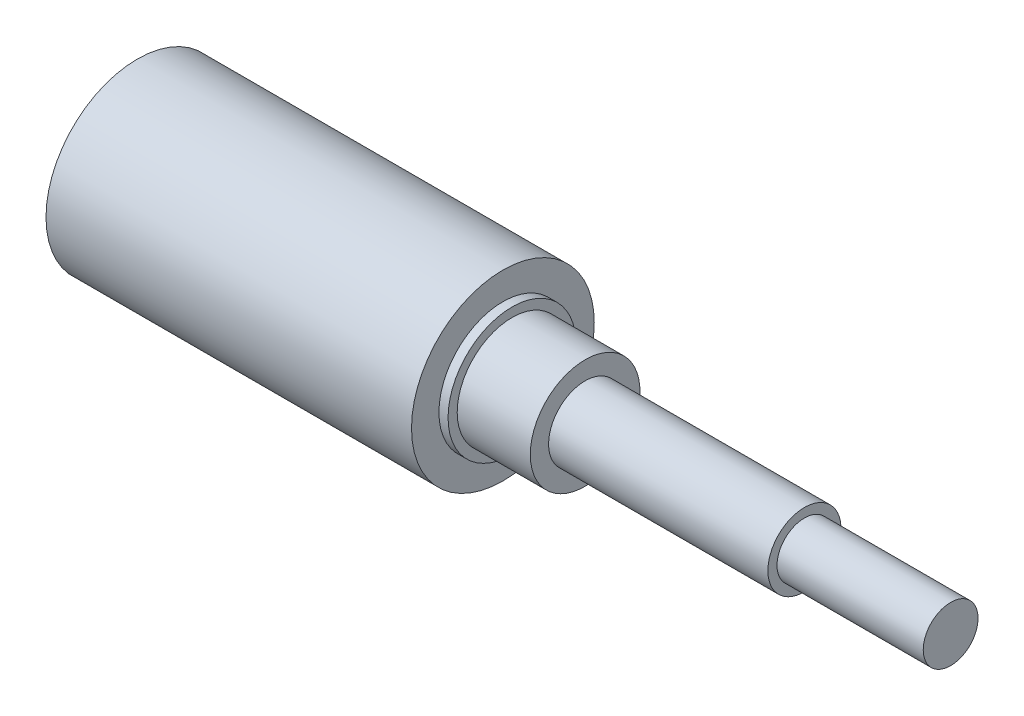
ISO-10303-21;
HEADER;
FILE_DESCRIPTION(('STEP AP214'),'2;1');
FILE_NAME('part.step','',(''),(''),'','','');
FILE_SCHEMA(('AUTOMOTIVE_DESIGN { 1 0 10303 214 1 1 1 1 }'));
ENDSEC;
DATA;
#1=APPLICATION_CONTEXT('core data for automotive mechanical design processes');
#2=APPLICATION_PROTOCOL_DEFINITION('international standard','automotive_design',2000,#1);
#3=PRODUCT_CONTEXT('',#1,'mechanical');
#4=PRODUCT('Part','Part','',(#3));
#5=PRODUCT_RELATED_PRODUCT_CATEGORY('part','',(#4));
#6=PRODUCT_DEFINITION_FORMATION('','',#4);
#7=PRODUCT_DEFINITION_CONTEXT('part definition',#1,'design');
#8=PRODUCT_DEFINITION('design','',#6,#7);
#9=PRODUCT_DEFINITION_SHAPE('','',#8);
#10=(LENGTH_UNIT() NAMED_UNIT(*) SI_UNIT(.MILLI.,.METRE.));
#11=(NAMED_UNIT(*) PLANE_ANGLE_UNIT() SI_UNIT($,.RADIAN.));
#12=(NAMED_UNIT(*) SI_UNIT($,.STERADIAN.) SOLID_ANGLE_UNIT());
#13=UNCERTAINTY_MEASURE_WITH_UNIT(LENGTH_MEASURE(1.E-05),#10,'distance_accuracy_value','');
#14=(GEOMETRIC_REPRESENTATION_CONTEXT(3) GLOBAL_UNCERTAINTY_ASSIGNED_CONTEXT((#13)) GLOBAL_UNIT_ASSIGNED_CONTEXT((#10,
#11,#12)) REPRESENTATION_CONTEXT('',''));
#15=CARTESIAN_POINT('',(0.,0.,0.));
#16=DIRECTION('',(0.,0.,1.));
#17=DIRECTION('',(1.,0.,0.));
#18=AXIS2_PLACEMENT_3D('',#15,#16,#17);
#19=CARTESIAN_POINT('',(0.,4.99999999999999,0.));
#20=DIRECTION('',(1.,0.,0.));
#21=DIRECTION('',(0.,0.,-1.));
#22=AXIS2_PLACEMENT_3D('',#19,#20,#21);
#23=PLANE('',#22);
#24=CARTESIAN_POINT('',(0.,0.,0.));
#25=DIRECTION('',(-1.,0.,0.));
#26=DIRECTION('',(0.,0.,1.));
#27=AXIS2_PLACEMENT_3D('',#24,#25,#26);
#28=CIRCLE('',#27,4.99999999999999);
#29=CARTESIAN_POINT('',(0.,0.,4.99999999999999));
#30=VERTEX_POINT('',#29);
#31=EDGE_CURVE('E65',#30,#30,#28,.T.);
#32=ORIENTED_EDGE('',*,*,#31,.T.);
#33=EDGE_LOOP('',(#32));
#34=FACE_BOUND('',#33,.T.);
#35=ADVANCED_FACE('F31',(#34),#23,.F.);
#36=CARTESIAN_POINT('',(44.5,0.,0.));
#37=DIRECTION('',(-1.,0.,0.));
#38=DIRECTION('',(0.,0.,1.));
#39=AXIS2_PLACEMENT_3D('',#36,#37,#38);
#40=PLANE('',#39);
#41=CARTESIAN_POINT('',(44.5,0.,0.));
#42=DIRECTION('',(-1.,0.,0.));
#43=DIRECTION('',(0.,0.,1.));
#44=AXIS2_PLACEMENT_3D('',#41,#42,#43);
#45=CIRCLE('',#44,1.5);
#46=CARTESIAN_POINT('',(44.5,0.,1.5));
#47=VERTEX_POINT('',#46);
#48=EDGE_CURVE('E10',#47,#47,#45,.T.);
#49=ORIENTED_EDGE('',*,*,#48,.F.);
#50=EDGE_LOOP('',(#49));
#51=FACE_BOUND('',#50,.T.);
#52=ADVANCED_FACE('F119',(#51),#40,.F.);
#53=CARTESIAN_POINT('',(0.,0.,0.));
#54=DIRECTION('',(-1.,0.,0.));
#55=DIRECTION('',(0.,0.,1.));
#56=AXIS2_PLACEMENT_3D('',#53,#54,#55);
#57=CYLINDRICAL_SURFACE('',#56,1.5);
#58=CARTESIAN_POINT('',(36.5,0.,0.));
#59=DIRECTION('',(-1.,0.,0.));
#60=DIRECTION('',(0.,0.,1.));
#61=AXIS2_PLACEMENT_3D('',#58,#59,#60);
#62=CIRCLE('',#61,1.5);
#63=CARTESIAN_POINT('',(36.5,0.,1.5));
#64=VERTEX_POINT('',#63);
#65=EDGE_CURVE('E37',#64,#64,#62,.T.);
#66=ORIENTED_EDGE('',*,*,#65,.F.);
#67=EDGE_LOOP('',(#66));
#68=FACE_BOUND('',#67,.T.);
#69=ORIENTED_EDGE('',*,*,#48,.T.);
#70=EDGE_LOOP('',(#69));
#71=FACE_BOUND('',#70,.T.);
#72=ADVANCED_FACE('F114',(#68,#71),#57,.T.);
#73=CARTESIAN_POINT('',(36.5,2.,0.));
#74=DIRECTION('',(-1.,0.,0.));
#75=DIRECTION('',(0.,0.,1.));
#76=AXIS2_PLACEMENT_3D('',#73,#74,#75);
#77=PLANE('',#76);
#78=CARTESIAN_POINT('',(36.5,0.,0.));
#79=DIRECTION('',(-1.,0.,0.));
#80=DIRECTION('',(0.,0.,1.));
#81=AXIS2_PLACEMENT_3D('',#78,#79,#80);
#82=CIRCLE('',#81,2.);
#83=CARTESIAN_POINT('',(36.5,0.,2.));
#84=VERTEX_POINT('',#83);
#85=EDGE_CURVE('E41',#84,#84,#82,.T.);
#86=ORIENTED_EDGE('',*,*,#85,.F.);
#87=EDGE_LOOP('',(#86));
#88=FACE_BOUND('',#87,.T.);
#89=ORIENTED_EDGE('',*,*,#65,.T.);
#90=EDGE_LOOP('',(#89));
#91=FACE_BOUND('',#90,.T.);
#92=ADVANCED_FACE('F109',(#88,#91),#77,.F.);
#93=CARTESIAN_POINT('',(0.,0.,0.));
#94=DIRECTION('',(-1.,0.,0.));
#95=DIRECTION('',(0.,0.,1.));
#96=AXIS2_PLACEMENT_3D('',#93,#94,#95);
#97=CYLINDRICAL_SURFACE('',#96,2.);
#98=CARTESIAN_POINT('',(24.5,0.,0.));
#99=DIRECTION('',(-1.,0.,0.));
#100=DIRECTION('',(0.,0.,1.));
#101=AXIS2_PLACEMENT_3D('',#98,#99,#100);
#102=CIRCLE('',#101,2.);
#103=CARTESIAN_POINT('',(24.5,0.,2.));
#104=VERTEX_POINT('',#103);
#105=EDGE_CURVE('E45',#104,#104,#102,.T.);
#106=ORIENTED_EDGE('',*,*,#105,.F.);
#107=EDGE_LOOP('',(#106));
#108=FACE_BOUND('',#107,.T.);
#109=ORIENTED_EDGE('',*,*,#85,.T.);
#110=EDGE_LOOP('',(#109));
#111=FACE_BOUND('',#110,.T.);
#112=ADVANCED_FACE('F103',(#108,#111),#97,.T.);
#113=CARTESIAN_POINT('',(24.5,2.,0.));
#114=DIRECTION('',(-1.,0.,0.));
#115=DIRECTION('',(0.,0.,1.));
#116=AXIS2_PLACEMENT_3D('',#113,#114,#115);
#117=PLANE('',#116);
#118=CARTESIAN_POINT('',(24.5,0.,0.));
#119=DIRECTION('',(-1.,0.,0.));
#120=DIRECTION('',(0.,0.,1.));
#121=AXIS2_PLACEMENT_3D('',#118,#119,#120);
#122=CIRCLE('',#121,3.);
#123=CARTESIAN_POINT('',(24.5,0.,3.));
#124=VERTEX_POINT('',#123);
#125=EDGE_CURVE('E50',#124,#124,#122,.T.);
#126=ORIENTED_EDGE('',*,*,#125,.F.);
#127=EDGE_LOOP('',(#126));
#128=FACE_BOUND('',#127,.T.);
#129=ORIENTED_EDGE('',*,*,#105,.T.);
#130=EDGE_LOOP('',(#129));
#131=FACE_BOUND('',#130,.T.);
#132=ADVANCED_FACE('F97',(#128,#131),#117,.F.);
#133=CARTESIAN_POINT('',(0.,0.,0.));
#134=DIRECTION('',(-1.,0.,0.));
#135=DIRECTION('',(0.,0.,1.));
#136=AXIS2_PLACEMENT_3D('',#133,#134,#135);
#137=CYLINDRICAL_SURFACE('',#136,3.);
#138=CARTESIAN_POINT('',(20.5,0.,0.));
#139=DIRECTION('',(-1.,0.,0.));
#140=DIRECTION('',(0.,0.,1.));
#141=AXIS2_PLACEMENT_3D('',#138,#139,#140);
#142=CIRCLE('',#141,3.);
#143=CARTESIAN_POINT('',(20.5,0.,3.));
#144=VERTEX_POINT('',#143);
#145=EDGE_CURVE('E53',#144,#144,#142,.T.);
#146=ORIENTED_EDGE('',*,*,#145,.F.);
#147=EDGE_LOOP('',(#146));
#148=FACE_BOUND('',#147,.T.);
#149=ORIENTED_EDGE('',*,*,#125,.T.);
#150=EDGE_LOOP('',(#149));
#151=FACE_BOUND('',#150,.T.);
#152=ADVANCED_FACE('F91',(#148,#151),#137,.T.);
#153=CARTESIAN_POINT('',(20.5,3.5,0.));
#154=DIRECTION('',(-1.,0.,0.));
#155=DIRECTION('',(0.,0.,1.));
#156=AXIS2_PLACEMENT_3D('',#153,#154,#155);
#157=PLANE('',#156);
#158=CARTESIAN_POINT('',(20.5,0.,0.));
#159=DIRECTION('',(-1.,0.,0.));
#160=DIRECTION('',(0.,0.,1.));
#161=AXIS2_PLACEMENT_3D('',#158,#159,#160);
#162=CIRCLE('',#161,3.5);
#163=CARTESIAN_POINT('',(20.5,0.,3.5));
#164=VERTEX_POINT('',#163);
#165=EDGE_CURVE('E56',#164,#164,#162,.T.);
#166=ORIENTED_EDGE('',*,*,#165,.F.);
#167=EDGE_LOOP('',(#166));
#168=FACE_BOUND('',#167,.T.);
#169=ORIENTED_EDGE('',*,*,#145,.T.);
#170=EDGE_LOOP('',(#169));
#171=FACE_BOUND('',#170,.T.);
#172=ADVANCED_FACE('F85',(#168,#171),#157,.F.);
#173=CARTESIAN_POINT('',(0.,0.,0.));
#174=DIRECTION('',(-1.,0.,0.));
#175=DIRECTION('',(0.,0.,1.));
#176=AXIS2_PLACEMENT_3D('',#173,#174,#175);
#177=CYLINDRICAL_SURFACE('',#176,3.5);
#178=CARTESIAN_POINT('',(20.,0.,0.));
#179=DIRECTION('',(-1.,0.,0.));
#180=DIRECTION('',(0.,0.,1.));
#181=AXIS2_PLACEMENT_3D('',#178,#179,#180);
#182=CIRCLE('',#181,3.5);
#183=CARTESIAN_POINT('',(20.,0.,3.5));
#184=VERTEX_POINT('',#183);
#185=EDGE_CURVE('E59',#184,#184,#182,.T.);
#186=ORIENTED_EDGE('',*,*,#185,.F.);
#187=EDGE_LOOP('',(#186));
#188=FACE_BOUND('',#187,.T.);
#189=ORIENTED_EDGE('',*,*,#165,.T.);
#190=EDGE_LOOP('',(#189));
#191=FACE_BOUND('',#190,.T.);
#192=ADVANCED_FACE('F79',(#188,#191),#177,.T.);
#193=CARTESIAN_POINT('',(20.,3.5,0.));
#194=DIRECTION('',(-1.,0.,0.));
#195=DIRECTION('',(0.,0.,1.));
#196=AXIS2_PLACEMENT_3D('',#193,#194,#195);
#197=PLANE('',#196);
#198=CARTESIAN_POINT('',(20.,0.,0.));
#199=DIRECTION('',(-1.,0.,0.));
#200=DIRECTION('',(0.,0.,1.));
#201=AXIS2_PLACEMENT_3D('',#198,#199,#200);
#202=CIRCLE('',#201,5.);
#203=CARTESIAN_POINT('',(20.,0.,5.));
#204=VERTEX_POINT('',#203);
#205=EDGE_CURVE('E62',#204,#204,#202,.T.);
#206=ORIENTED_EDGE('',*,*,#205,.F.);
#207=EDGE_LOOP('',(#206));
#208=FACE_BOUND('',#207,.T.);
#209=ORIENTED_EDGE('',*,*,#185,.T.);
#210=EDGE_LOOP('',(#209));
#211=FACE_BOUND('',#210,.T.);
#212=ADVANCED_FACE('F73',(#208,#211),#197,.F.);
#213=CARTESIAN_POINT('',(0.,0.,0.));
#214=DIRECTION('',(-1.,0.,0.));
#215=DIRECTION('',(0.,0.,1.));
#216=AXIS2_PLACEMENT_3D('',#213,#214,#215);
#217=CYLINDRICAL_SURFACE('',#216,5.);
#218=ORIENTED_EDGE('',*,*,#31,.F.);
#219=EDGE_LOOP('',(#218));
#220=FACE_BOUND('',#219,.T.);
#221=ORIENTED_EDGE('',*,*,#205,.T.);
#222=EDGE_LOOP('',(#221));
#223=FACE_BOUND('',#222,.T.);
#224=ADVANCED_FACE('F70',(#220,#223),#217,.T.);
#225=CLOSED_SHELL('',(#35,#52,#72,#92,#112,#132,#152,#172,#192,#212,#224));
#226=MANIFOLD_SOLID_BREP('B2',#225);
#227=ADVANCED_BREP_SHAPE_REPRESENTATION('',(#18,#226),#14);
#228=SHAPE_DEFINITION_REPRESENTATION(#9,#227);
ENDSEC;
END-ISO-10303-21;
